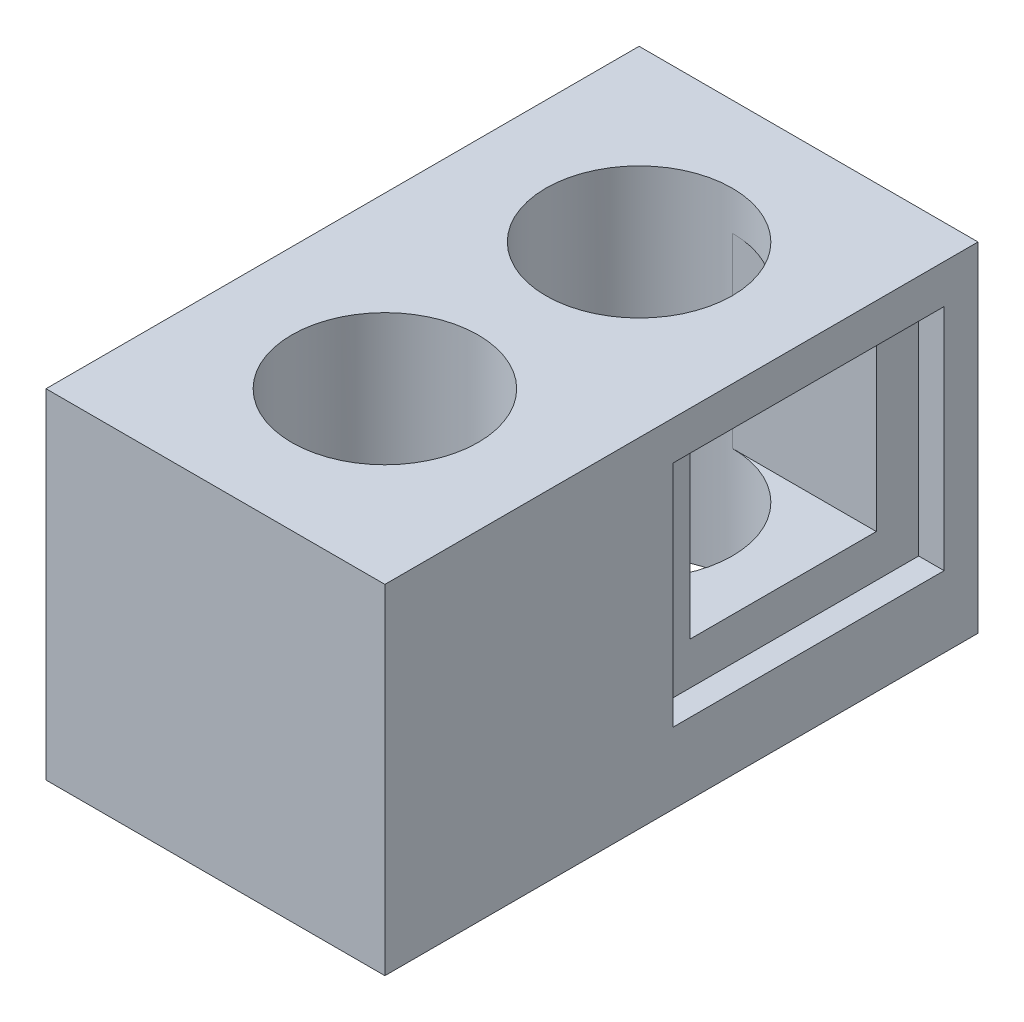
ISO-10303-21;
HEADER;
FILE_DESCRIPTION(('STEP AP214'),'2;1');
FILE_NAME('part.step','',(''),(''),'','','');
FILE_SCHEMA(('AUTOMOTIVE_DESIGN { 1 0 10303 214 1 1 1 1 }'));
ENDSEC;
DATA;
#1=APPLICATION_CONTEXT('core data for automotive mechanical design processes');
#2=APPLICATION_PROTOCOL_DEFINITION('international standard','automotive_design',2000,#1);
#3=PRODUCT_CONTEXT('',#1,'mechanical');
#4=PRODUCT('Part','Part','',(#3));
#5=PRODUCT_RELATED_PRODUCT_CATEGORY('part','',(#4));
#6=PRODUCT_DEFINITION_FORMATION('','',#4);
#7=PRODUCT_DEFINITION_CONTEXT('part definition',#1,'design');
#8=PRODUCT_DEFINITION('design','',#6,#7);
#9=PRODUCT_DEFINITION_SHAPE('','',#8);
#10=(LENGTH_UNIT() NAMED_UNIT(*) SI_UNIT(.MILLI.,.METRE.));
#11=(NAMED_UNIT(*) PLANE_ANGLE_UNIT() SI_UNIT($,.RADIAN.));
#12=(NAMED_UNIT(*) SI_UNIT($,.STERADIAN.) SOLID_ANGLE_UNIT());
#13=UNCERTAINTY_MEASURE_WITH_UNIT(LENGTH_MEASURE(1.E-05),#10,'distance_accuracy_value','');
#14=(GEOMETRIC_REPRESENTATION_CONTEXT(3) GLOBAL_UNCERTAINTY_ASSIGNED_CONTEXT((#13)) GLOBAL_UNIT_ASSIGNED_CONTEXT((#10,
#11,#12)) REPRESENTATION_CONTEXT('',''));
#15=CARTESIAN_POINT('',(0.,0.,0.));
#16=DIRECTION('',(0.,0.,1.));
#17=DIRECTION('',(1.,0.,0.));
#18=AXIS2_PLACEMENT_3D('',#15,#16,#17);
#19=CARTESIAN_POINT('',(63.7810047013809,17.7,80.0414003801951));
#20=DIRECTION('',(0.,0.,1.));
#21=DIRECTION('',(1.,0.,0.));
#22=AXIS2_PLACEMENT_3D('',#19,#20,#21);
#23=PLANE('',#22);
#24=DIRECTION('',(0.,1.,0.));
#25=VECTOR('',#24,1.);
#26=CARTESIAN_POINT('',(72.2810047013808,17.7,80.0414003801951));
#27=LINE('',#26,#25);
#28=CARTESIAN_POINT('',(72.2810047013808,6.7,80.0414003801951));
#29=VERTEX_POINT('',#28);
#30=CARTESIAN_POINT('',(72.2810047013808,17.7,80.0414003801951));
#31=VERTEX_POINT('',#30);
#32=EDGE_CURVE('E169',#29,#31,#27,.T.);
#33=ORIENTED_EDGE('',*,*,#32,.F.);
#34=DIRECTION('',(1.,0.,0.));
#35=VECTOR('',#34,1.);
#36=CARTESIAN_POINT('',(63.7810047013809,6.7,80.0414003801951));
#37=LINE('',#36,#35);
#38=CARTESIAN_POINT('',(63.7810047013809,6.7,80.0414003801951));
#39=VERTEX_POINT('',#38);
#40=EDGE_CURVE('E177',#39,#29,#37,.T.);
#41=ORIENTED_EDGE('',*,*,#40,.F.);
#42=DIRECTION('',(0.,-1.,0.));
#43=VECTOR('',#42,1.);
#44=CARTESIAN_POINT('',(63.7810047013809,17.7,80.0414003801951));
#45=LINE('',#44,#43);
#46=CARTESIAN_POINT('',(63.7810047013809,17.7,80.0414003801951));
#47=VERTEX_POINT('',#46);
#48=EDGE_CURVE('E171',#47,#39,#45,.T.);
#49=ORIENTED_EDGE('',*,*,#48,.F.);
#50=DIRECTION('',(1.,0.,0.));
#51=VECTOR('',#50,1.);
#52=CARTESIAN_POINT('',(63.7810047013809,17.7,80.0414003801951));
#53=LINE('',#52,#51);
#54=EDGE_CURVE('E178',#47,#31,#53,.T.);
#55=ORIENTED_EDGE('',*,*,#54,.T.);
#56=EDGE_LOOP('',(#33,#41,#49,#55));
#57=FACE_BOUND('',#56,.T.);
#58=ADVANCED_FACE('F38',(#57),#23,.F.);
#59=CARTESIAN_POINT('',(63.7810047013809,17.7,69.0414003801951));
#60=DIRECTION('',(0.,0.,-1.));
#61=DIRECTION('',(-1.,0.,0.));
#62=AXIS2_PLACEMENT_3D('',#59,#60,#61);
#63=PLANE('',#62);
#64=DIRECTION('',(0.,-1.,0.));
#65=VECTOR('',#64,1.);
#66=CARTESIAN_POINT('',(72.2810047013808,17.7,69.0414003801951));
#67=LINE('',#66,#65);
#68=CARTESIAN_POINT('',(72.2810047013808,17.7,69.0414003801951));
#69=VERTEX_POINT('',#68);
#70=CARTESIAN_POINT('',(72.2810047013808,6.7,69.0414003801951));
#71=VERTEX_POINT('',#70);
#72=EDGE_CURVE('E52',#69,#71,#67,.T.);
#73=ORIENTED_EDGE('',*,*,#72,.F.);
#74=DIRECTION('',(1.,0.,0.));
#75=VECTOR('',#74,1.);
#76=CARTESIAN_POINT('',(63.7810047013809,17.7,69.0414003801951));
#77=LINE('',#76,#75);
#78=CARTESIAN_POINT('',(63.7810047013809,17.7,69.0414003801951));
#79=VERTEX_POINT('',#78);
#80=EDGE_CURVE('E59',#79,#69,#77,.T.);
#81=ORIENTED_EDGE('',*,*,#80,.F.);
#82=DIRECTION('',(0.,1.,0.));
#83=VECTOR('',#82,1.);
#84=CARTESIAN_POINT('',(63.7810047013809,17.7,69.0414003801951));
#85=LINE('',#84,#83);
#86=CARTESIAN_POINT('',(63.7810047013809,6.7,69.0414003801951));
#87=VERTEX_POINT('',#86);
#88=EDGE_CURVE('E174',#87,#79,#85,.T.);
#89=ORIENTED_EDGE('',*,*,#88,.F.);
#90=DIRECTION('',(1.,0.,0.));
#91=VECTOR('',#90,1.);
#92=CARTESIAN_POINT('',(63.7810047013809,6.7,69.0414003801951));
#93=LINE('',#92,#91);
#94=EDGE_CURVE('E183',#87,#71,#93,.T.);
#95=ORIENTED_EDGE('',*,*,#94,.T.);
#96=EDGE_LOOP('',(#73,#81,#89,#95));
#97=FACE_BOUND('',#96,.T.);
#98=ADVANCED_FACE('F246',(#97),#63,.F.);
#99=CARTESIAN_POINT('',(63.7810047013809,6.7,69.0414003801951));
#100=DIRECTION('',(0.,-1.,0.));
#101=DIRECTION('',(0.,0.,-1.));
#102=AXIS2_PLACEMENT_3D('',#99,#100,#101);
#103=PLANE('',#102);
#104=DIRECTION('',(0.,0.,1.));
#105=VECTOR('',#104,1.);
#106=CARTESIAN_POINT('',(72.2810047013808,6.7,69.0414003801951));
#107=LINE('',#106,#105);
#108=EDGE_CURVE('E11',#71,#29,#107,.T.);
#109=ORIENTED_EDGE('',*,*,#108,.F.);
#110=ORIENTED_EDGE('',*,*,#94,.F.);
#111=CARTESIAN_POINT('',(63.7810047013808,6.7,74.5414003801951));
#112=DIRECTION('',(0.,-1.,0.));
#113=DIRECTION('',(0.,0.,-1.));
#114=AXIS2_PLACEMENT_3D('',#111,#112,#113);
#115=CIRCLE('',#114,5.5);
#116=EDGE_CURVE('E231',#39,#87,#115,.F.);
#117=ORIENTED_EDGE('',*,*,#116,.F.);
#118=ORIENTED_EDGE('',*,*,#40,.T.);
#119=EDGE_LOOP('',(#109,#110,#117,#118));
#120=FACE_BOUND('',#119,.T.);
#121=ADVANCED_FACE('F245',(#120),#103,.F.);
#122=CARTESIAN_POINT('',(0.,20.,0.));
#123=DIRECTION('',(0.,-1.,0.));
#124=DIRECTION('',(0.,0.,-1.));
#125=AXIS2_PLACEMENT_3D('',#122,#123,#124);
#126=PLANE('',#125);
#127=CARTESIAN_POINT('',(63.7810047013808,20.,74.5414003801951));
#128=DIRECTION('',(0.,-1.,0.));
#129=DIRECTION('',(0.,0.,-1.));
#130=AXIS2_PLACEMENT_3D('',#127,#128,#129);
#131=CIRCLE('',#130,5.5);
#132=CARTESIAN_POINT('',(63.7810047013808,20.,69.0414003801951));
#133=VERTEX_POINT('',#132);
#134=EDGE_CURVE('E198',#133,#133,#131,.T.);
#135=ORIENTED_EDGE('',*,*,#134,.T.);
#136=EDGE_LOOP('',(#135));
#137=FACE_BOUND('',#136,.T.);
#138=CARTESIAN_POINT('',(63.7810047013808,20.,89.5414003801951));
#139=DIRECTION('',(0.,-1.,0.));
#140=DIRECTION('',(0.,0.,-1.));
#141=AXIS2_PLACEMENT_3D('',#138,#139,#140);
#142=CIRCLE('',#141,5.5);
#143=CARTESIAN_POINT('',(63.7810047013808,20.,84.0414003801951));
#144=VERTEX_POINT('',#143);
#145=EDGE_CURVE('E193',#144,#144,#142,.T.);
#146=ORIENTED_EDGE('',*,*,#145,.T.);
#147=EDGE_LOOP('',(#146));
#148=FACE_BOUND('',#147,.T.);
#149=DIRECTION('',(0.,0.,1.));
#150=VECTOR('',#149,1.);
#151=CARTESIAN_POINT('',(53.7810047013808,20.,64.5414003801951));
#152=LINE('',#151,#150);
#153=CARTESIAN_POINT('',(53.7810047013808,20.,64.5414003801951));
#154=VERTEX_POINT('',#153);
#155=CARTESIAN_POINT('',(53.7810047013808,20.,99.5414003801951));
#156=VERTEX_POINT('',#155);
#157=EDGE_CURVE('E202',#154,#156,#152,.T.);
#158=ORIENTED_EDGE('',*,*,#157,.T.);
#159=DIRECTION('',(1.,0.,0.));
#160=VECTOR('',#159,1.);
#161=CARTESIAN_POINT('',(73.7810047013808,20.,99.5414003801951));
#162=LINE('',#161,#160);
#163=CARTESIAN_POINT('',(73.7810047013808,20.,99.5414003801951));
#164=VERTEX_POINT('',#163);
#165=EDGE_CURVE('E205',#156,#164,#162,.T.);
#166=ORIENTED_EDGE('',*,*,#165,.T.);
#167=DIRECTION('',(0.,0.,-1.));
#168=VECTOR('',#167,1.);
#169=CARTESIAN_POINT('',(73.7810047013808,20.,64.5414003801951));
#170=LINE('',#169,#168);
#171=CARTESIAN_POINT('',(73.7810047013808,20.,64.5414003801951));
#172=VERTEX_POINT('',#171);
#173=EDGE_CURVE('E208',#164,#172,#170,.T.);
#174=ORIENTED_EDGE('',*,*,#173,.T.);
#175=DIRECTION('',(-1.,0.,0.));
#176=VECTOR('',#175,1.);
#177=CARTESIAN_POINT('',(73.7810047013808,20.,64.5414003801951));
#178=LINE('',#177,#176);
#179=EDGE_CURVE('E210',#172,#154,#178,.T.);
#180=ORIENTED_EDGE('',*,*,#179,.T.);
#181=EDGE_LOOP('',(#158,#166,#174,#180));
#182=FACE_BOUND('',#181,.T.);
#183=ADVANCED_FACE('F253',(#137,#148,#182),#126,.F.);
#184=CARTESIAN_POINT('',(0.,0.,0.));
#185=DIRECTION('',(0.,-1.,0.));
#186=DIRECTION('',(0.,0.,-1.));
#187=AXIS2_PLACEMENT_3D('',#184,#185,#186);
#188=PLANE('',#187);
#189=CARTESIAN_POINT('',(63.7810047013808,0.,74.5414003801951));
#190=DIRECTION('',(0.,1.,0.));
#191=DIRECTION('',(0.,0.,1.));
#192=AXIS2_PLACEMENT_3D('',#189,#190,#191);
#193=CIRCLE('',#192,5.5);
#194=CARTESIAN_POINT('',(63.7810047013808,0.,80.0414003801951));
#195=VERTEX_POINT('',#194);
#196=EDGE_CURVE('E190',#195,#195,#193,.T.);
#197=ORIENTED_EDGE('',*,*,#196,.T.);
#198=EDGE_LOOP('',(#197));
#199=FACE_BOUND('',#198,.T.);
#200=CARTESIAN_POINT('',(63.7810047013808,0.,89.5414003801951));
#201=DIRECTION('',(0.,1.,0.));
#202=DIRECTION('',(0.,0.,1.));
#203=AXIS2_PLACEMENT_3D('',#200,#201,#202);
#204=CIRCLE('',#203,5.5);
#205=CARTESIAN_POINT('',(63.7810047013808,0.,95.0414003801951));
#206=VERTEX_POINT('',#205);
#207=EDGE_CURVE('E189',#206,#206,#204,.T.);
#208=ORIENTED_EDGE('',*,*,#207,.T.);
#209=EDGE_LOOP('',(#208));
#210=FACE_BOUND('',#209,.T.);
#211=DIRECTION('',(0.,0.,1.));
#212=VECTOR('',#211,1.);
#213=CARTESIAN_POINT('',(53.7810047013808,0.,64.5414003801951));
#214=LINE('',#213,#212);
#215=CARTESIAN_POINT('',(53.7810047013808,0.,64.5414003801951));
#216=VERTEX_POINT('',#215);
#217=CARTESIAN_POINT('',(53.7810047013808,0.,99.5414003801951));
#218=VERTEX_POINT('',#217);
#219=EDGE_CURVE('E201',#216,#218,#214,.T.);
#220=ORIENTED_EDGE('',*,*,#219,.F.);
#221=DIRECTION('',(-1.,0.,0.));
#222=VECTOR('',#221,1.);
#223=CARTESIAN_POINT('',(73.7810047013808,0.,64.5414003801951));
#224=LINE('',#223,#222);
#225=CARTESIAN_POINT('',(73.7810047013808,0.,64.5414003801951));
#226=VERTEX_POINT('',#225);
#227=EDGE_CURVE('E206',#226,#216,#224,.T.);
#228=ORIENTED_EDGE('',*,*,#227,.F.);
#229=DIRECTION('',(0.,0.,-1.));
#230=VECTOR('',#229,1.);
#231=CARTESIAN_POINT('',(73.7810047013808,0.,64.5414003801951));
#232=LINE('',#231,#230);
#233=CARTESIAN_POINT('',(73.7810047013808,0.,99.5414003801951));
#234=VERTEX_POINT('',#233);
#235=EDGE_CURVE('E217',#234,#226,#232,.T.);
#236=ORIENTED_EDGE('',*,*,#235,.F.);
#237=DIRECTION('',(1.,0.,0.));
#238=VECTOR('',#237,1.);
#239=CARTESIAN_POINT('',(73.7810047013808,0.,99.5414003801951));
#240=LINE('',#239,#238);
#241=EDGE_CURVE('E215',#218,#234,#240,.T.);
#242=ORIENTED_EDGE('',*,*,#241,.F.);
#243=EDGE_LOOP('',(#220,#228,#236,#242));
#244=FACE_BOUND('',#243,.T.);
#245=ADVANCED_FACE('F268',(#199,#210,#244),#188,.T.);
#246=CARTESIAN_POINT('',(53.7810047013808,20.,64.5414003801951));
#247=DIRECTION('',(1.,0.,0.));
#248=DIRECTION('',(0.,0.,-1.));
#249=AXIS2_PLACEMENT_3D('',#246,#247,#248);
#250=PLANE('',#249);
#251=ORIENTED_EDGE('',*,*,#219,.T.);
#252=DIRECTION('',(0.,-1.,0.));
#253=VECTOR('',#252,1.);
#254=CARTESIAN_POINT('',(53.7810047013808,20.,99.5414003801951));
#255=LINE('',#254,#253);
#256=EDGE_CURVE('E228',#156,#218,#255,.T.);
#257=ORIENTED_EDGE('',*,*,#256,.F.);
#258=ORIENTED_EDGE('',*,*,#157,.F.);
#259=DIRECTION('',(0.,-1.,0.));
#260=VECTOR('',#259,1.);
#261=CARTESIAN_POINT('',(53.7810047013808,20.,64.5414003801951));
#262=LINE('',#261,#260);
#263=EDGE_CURVE('E212',#154,#216,#262,.T.);
#264=ORIENTED_EDGE('',*,*,#263,.T.);
#265=EDGE_LOOP('',(#251,#257,#258,#264));
#266=FACE_BOUND('',#265,.T.);
#267=ADVANCED_FACE('F40',(#266),#250,.F.);
#268=CARTESIAN_POINT('',(73.7810047013808,20.,99.5414003801951));
#269=DIRECTION('',(0.,0.,-1.));
#270=DIRECTION('',(-1.,0.,0.));
#271=AXIS2_PLACEMENT_3D('',#268,#269,#270);
#272=PLANE('',#271);
#273=ORIENTED_EDGE('',*,*,#241,.T.);
#274=DIRECTION('',(0.,-1.,0.));
#275=VECTOR('',#274,1.);
#276=CARTESIAN_POINT('',(73.7810047013808,20.,99.5414003801951));
#277=LINE('',#276,#275);
#278=EDGE_CURVE('E225',#164,#234,#277,.T.);
#279=ORIENTED_EDGE('',*,*,#278,.F.);
#280=ORIENTED_EDGE('',*,*,#165,.F.);
#281=ORIENTED_EDGE('',*,*,#256,.T.);
#282=EDGE_LOOP('',(#273,#279,#280,#281));
#283=FACE_BOUND('',#282,.T.);
#284=ADVANCED_FACE('F278',(#283),#272,.F.);
#285=CARTESIAN_POINT('',(73.7810047013808,20.,64.5414003801951));
#286=DIRECTION('',(-1.,0.,0.));
#287=DIRECTION('',(0.,0.,1.));
#288=AXIS2_PLACEMENT_3D('',#285,#286,#287);
#289=PLANE('',#288);
#290=DIRECTION('',(0.,-1.,0.));
#291=VECTOR('',#290,1.);
#292=CARTESIAN_POINT('',(73.7810047013808,17.7,82.5414003801951));
#293=LINE('',#292,#291);
#294=CARTESIAN_POINT('',(73.7810047013808,17.7,82.5414003801951));
#295=VERTEX_POINT('',#294);
#296=CARTESIAN_POINT('',(73.7810047013808,4.2,82.5414003801951));
#297=VERTEX_POINT('',#296);
#298=EDGE_CURVE('E134',#295,#297,#293,.T.);
#299=ORIENTED_EDGE('',*,*,#298,.F.);
#300=DIRECTION('',(0.,0.,-1.));
#301=VECTOR('',#300,1.);
#302=CARTESIAN_POINT('',(73.7810047013808,17.7,64.5414003801951));
#303=LINE('',#302,#301);
#304=CARTESIAN_POINT('',(73.7810047013808,17.7,66.5414003801951));
#305=VERTEX_POINT('',#304);
#306=EDGE_CURVE('E181',#295,#305,#303,.T.);
#307=ORIENTED_EDGE('',*,*,#306,.T.);
#308=DIRECTION('',(0.,1.,0.));
#309=VECTOR('',#308,1.);
#310=CARTESIAN_POINT('',(73.7810047013808,17.7,66.5414003801951));
#311=LINE('',#310,#309);
#312=CARTESIAN_POINT('',(73.7810047013808,4.2,66.5414003801951));
#313=VERTEX_POINT('',#312);
#314=EDGE_CURVE('E152',#313,#305,#311,.T.);
#315=ORIENTED_EDGE('',*,*,#314,.F.);
#316=DIRECTION('',(0.,0.,-1.));
#317=VECTOR('',#316,1.);
#318=CARTESIAN_POINT('',(73.7810047013808,4.2,82.5414003801951));
#319=LINE('',#318,#317);
#320=EDGE_CURVE('E155',#297,#313,#319,.T.);
#321=ORIENTED_EDGE('',*,*,#320,.F.);
#322=EDGE_LOOP('',(#299,#307,#315,#321));
#323=FACE_BOUND('',#322,.T.);
#324=ORIENTED_EDGE('',*,*,#235,.T.);
#325=DIRECTION('',(0.,-1.,0.));
#326=VECTOR('',#325,1.);
#327=CARTESIAN_POINT('',(73.7810047013808,20.,64.5414003801951));
#328=LINE('',#327,#326);
#329=EDGE_CURVE('E222',#172,#226,#328,.T.);
#330=ORIENTED_EDGE('',*,*,#329,.F.);
#331=ORIENTED_EDGE('',*,*,#173,.F.);
#332=ORIENTED_EDGE('',*,*,#278,.T.);
#333=EDGE_LOOP('',(#324,#330,#331,#332));
#334=FACE_BOUND('',#333,.T.);
#335=ADVANCED_FACE('F275',(#323,#334),#289,.F.);
#336=CARTESIAN_POINT('',(73.7810047013808,20.,64.5414003801951));
#337=DIRECTION('',(0.,0.,1.));
#338=DIRECTION('',(1.,0.,0.));
#339=AXIS2_PLACEMENT_3D('',#336,#337,#338);
#340=PLANE('',#339);
#341=ORIENTED_EDGE('',*,*,#227,.T.);
#342=ORIENTED_EDGE('',*,*,#263,.F.);
#343=ORIENTED_EDGE('',*,*,#179,.F.);
#344=ORIENTED_EDGE('',*,*,#329,.T.);
#345=EDGE_LOOP('',(#341,#342,#343,#344));
#346=FACE_BOUND('',#345,.T.);
#347=ADVANCED_FACE('F264',(#346),#340,.F.);
#348=CARTESIAN_POINT('',(63.7810047013808,0.,89.5414003801951));
#349=DIRECTION('',(0.,1.,0.));
#350=DIRECTION('',(0.,0.,1.));
#351=AXIS2_PLACEMENT_3D('',#348,#349,#350);
#352=CYLINDRICAL_SURFACE('',#351,5.5);
#353=ORIENTED_EDGE('',*,*,#207,.F.);
#354=EDGE_LOOP('',(#353));
#355=FACE_BOUND('',#354,.T.);
#356=ORIENTED_EDGE('',*,*,#145,.F.);
#357=EDGE_LOOP('',(#356));
#358=FACE_BOUND('',#357,.T.);
#359=ADVANCED_FACE('F261',(#355,#358),#352,.F.);
#360=CARTESIAN_POINT('',(63.7810047013808,0.,74.5414003801951));
#361=DIRECTION('',(0.,1.,0.));
#362=DIRECTION('',(0.,0.,1.));
#363=AXIS2_PLACEMENT_3D('',#360,#361,#362);
#364=CYLINDRICAL_SURFACE('',#363,5.5);
#365=ORIENTED_EDGE('',*,*,#88,.T.);
#366=CARTESIAN_POINT('',(63.7810047013808,17.7,74.5414003801951));
#367=DIRECTION('',(0.,1.,0.));
#368=DIRECTION('',(0.,0.,1.));
#369=AXIS2_PLACEMENT_3D('',#366,#367,#368);
#370=CIRCLE('',#369,5.5);
#371=EDGE_CURVE('E46',#79,#47,#370,.F.);
#372=ORIENTED_EDGE('',*,*,#371,.T.);
#373=ORIENTED_EDGE('',*,*,#48,.T.);
#374=ORIENTED_EDGE('',*,*,#116,.T.);
#375=EDGE_LOOP('',(#365,#372,#373,#374));
#376=FACE_BOUND('',#375,.T.);
#377=ORIENTED_EDGE('',*,*,#196,.F.);
#378=EDGE_LOOP('',(#377));
#379=FACE_BOUND('',#378,.T.);
#380=ORIENTED_EDGE('',*,*,#134,.F.);
#381=EDGE_LOOP('',(#380));
#382=FACE_BOUND('',#381,.T.);
#383=ADVANCED_FACE('F235',(#376,#379,#382),#364,.F.);
#384=CARTESIAN_POINT('',(63.7810047013809,17.7,69.0414003801951));
#385=DIRECTION('',(0.,1.,0.));
#386=DIRECTION('',(0.,0.,1.));
#387=AXIS2_PLACEMENT_3D('',#384,#385,#386);
#388=PLANE('',#387);
#389=ORIENTED_EDGE('',*,*,#306,.F.);
#390=DIRECTION('',(1.,0.,0.));
#391=VECTOR('',#390,1.);
#392=CARTESIAN_POINT('',(72.2810047013808,17.7,82.5414003801951));
#393=LINE('',#392,#391);
#394=CARTESIAN_POINT('',(72.2810047013808,17.7,82.5414003801951));
#395=VERTEX_POINT('',#394);
#396=EDGE_CURVE('E162',#395,#295,#393,.T.);
#397=ORIENTED_EDGE('',*,*,#396,.F.);
#398=DIRECTION('',(0.,0.,1.));
#399=VECTOR('',#398,1.);
#400=CARTESIAN_POINT('',(72.2810047013808,17.7,82.5414003801951));
#401=LINE('',#400,#399);
#402=EDGE_CURVE('E150',#31,#395,#401,.T.);
#403=ORIENTED_EDGE('',*,*,#402,.F.);
#404=ORIENTED_EDGE('',*,*,#54,.F.);
#405=ORIENTED_EDGE('',*,*,#371,.F.);
#406=ORIENTED_EDGE('',*,*,#80,.T.);
#407=CARTESIAN_POINT('',(72.2810047013808,17.7,66.5414003801951));
#408=VERTEX_POINT('',#407);
#409=EDGE_CURVE('E139',#408,#69,#401,.T.);
#410=ORIENTED_EDGE('',*,*,#409,.F.);
#411=DIRECTION('',(1.,0.,0.));
#412=VECTOR('',#411,1.);
#413=CARTESIAN_POINT('',(72.2810047013808,17.7,66.5414003801951));
#414=LINE('',#413,#412);
#415=EDGE_CURVE('E164',#408,#305,#414,.T.);
#416=ORIENTED_EDGE('',*,*,#415,.T.);
#417=EDGE_LOOP('',(#389,#397,#403,#404,#405,#406,#410,#416));
#418=FACE_BOUND('',#417,.T.);
#419=ADVANCED_FACE('F239',(#418),#388,.F.);
#420=CARTESIAN_POINT('',(72.2810047013808,0.,0.));
#421=DIRECTION('',(1.,0.,0.));
#422=DIRECTION('',(0.,0.,-1.));
#423=AXIS2_PLACEMENT_3D('',#420,#421,#422);
#424=PLANE('',#423);
#425=ORIENTED_EDGE('',*,*,#32,.T.);
#426=ORIENTED_EDGE('',*,*,#402,.T.);
#427=DIRECTION('',(0.,-1.,0.));
#428=VECTOR('',#427,1.);
#429=CARTESIAN_POINT('',(72.2810047013808,17.7,82.5414003801951));
#430=LINE('',#429,#428);
#431=CARTESIAN_POINT('',(72.2810047013808,4.2,82.5414003801951));
#432=VERTEX_POINT('',#431);
#433=EDGE_CURVE('E132',#395,#432,#430,.T.);
#434=ORIENTED_EDGE('',*,*,#433,.T.);
#435=DIRECTION('',(0.,0.,-1.));
#436=VECTOR('',#435,1.);
#437=CARTESIAN_POINT('',(72.2810047013808,4.2,82.5414003801951));
#438=LINE('',#437,#436);
#439=CARTESIAN_POINT('',(72.2810047013808,4.2,66.5414003801951));
#440=VERTEX_POINT('',#439);
#441=EDGE_CURVE('E142',#432,#440,#438,.T.);
#442=ORIENTED_EDGE('',*,*,#441,.T.);
#443=DIRECTION('',(0.,1.,0.));
#444=VECTOR('',#443,1.);
#445=CARTESIAN_POINT('',(72.2810047013808,17.7,66.5414003801951));
#446=LINE('',#445,#444);
#447=EDGE_CURVE('E146',#440,#408,#446,.T.);
#448=ORIENTED_EDGE('',*,*,#447,.T.);
#449=ORIENTED_EDGE('',*,*,#409,.T.);
#450=ORIENTED_EDGE('',*,*,#72,.T.);
#451=ORIENTED_EDGE('',*,*,#108,.T.);
#452=EDGE_LOOP('',(#425,#426,#434,#442,#448,#449,#450,#451));
#453=FACE_BOUND('',#452,.T.);
#454=ADVANCED_FACE('F148',(#453),#424,.T.);
#455=CARTESIAN_POINT('',(72.2810047013808,17.7,82.5414003801951));
#456=DIRECTION('',(0.,0.,1.));
#457=DIRECTION('',(1.,0.,0.));
#458=AXIS2_PLACEMENT_3D('',#455,#456,#457);
#459=PLANE('',#458);
#460=ORIENTED_EDGE('',*,*,#298,.T.);
#461=DIRECTION('',(1.,0.,0.));
#462=VECTOR('',#461,1.);
#463=CARTESIAN_POINT('',(72.2810047013808,4.2,82.5414003801951));
#464=LINE('',#463,#462);
#465=EDGE_CURVE('E127',#432,#297,#464,.T.);
#466=ORIENTED_EDGE('',*,*,#465,.F.);
#467=ORIENTED_EDGE('',*,*,#433,.F.);
#468=ORIENTED_EDGE('',*,*,#396,.T.);
#469=EDGE_LOOP('',(#460,#466,#467,#468));
#470=FACE_BOUND('',#469,.T.);
#471=ADVANCED_FACE('F129',(#470),#459,.F.);
#472=CARTESIAN_POINT('',(72.2810047013808,17.7,66.5414003801951));
#473=DIRECTION('',(0.,0.,-1.));
#474=DIRECTION('',(-1.,0.,0.));
#475=AXIS2_PLACEMENT_3D('',#472,#473,#474);
#476=PLANE('',#475);
#477=ORIENTED_EDGE('',*,*,#314,.T.);
#478=ORIENTED_EDGE('',*,*,#415,.F.);
#479=ORIENTED_EDGE('',*,*,#447,.F.);
#480=DIRECTION('',(1.,0.,0.));
#481=VECTOR('',#480,1.);
#482=CARTESIAN_POINT('',(72.2810047013808,4.2,66.5414003801951));
#483=LINE('',#482,#481);
#484=EDGE_CURVE('E138',#440,#313,#483,.T.);
#485=ORIENTED_EDGE('',*,*,#484,.T.);
#486=EDGE_LOOP('',(#477,#478,#479,#485));
#487=FACE_BOUND('',#486,.T.);
#488=ADVANCED_FACE('F374',(#487),#476,.F.);
#489=CARTESIAN_POINT('',(72.2810047013808,4.2,82.5414003801951));
#490=DIRECTION('',(0.,-1.,0.));
#491=DIRECTION('',(0.,0.,-1.));
#492=AXIS2_PLACEMENT_3D('',#489,#490,#491);
#493=PLANE('',#492);
#494=ORIENTED_EDGE('',*,*,#320,.T.);
#495=ORIENTED_EDGE('',*,*,#484,.F.);
#496=ORIENTED_EDGE('',*,*,#441,.F.);
#497=ORIENTED_EDGE('',*,*,#465,.T.);
#498=EDGE_LOOP('',(#494,#495,#496,#497));
#499=FACE_BOUND('',#498,.T.);
#500=ADVANCED_FACE('F143',(#499),#493,.F.);
#501=CLOSED_SHELL('',(#58,#98,#121,#183,#245,#267,#284,#335,#347,#359,#383,#419,#454,#471,#488,#500));
#502=MANIFOLD_SOLID_BREP('B2',#501);
#503=ADVANCED_BREP_SHAPE_REPRESENTATION('',(#18,#502),#14);
#504=SHAPE_DEFINITION_REPRESENTATION(#9,#503);
ENDSEC;
END-ISO-10303-21;
